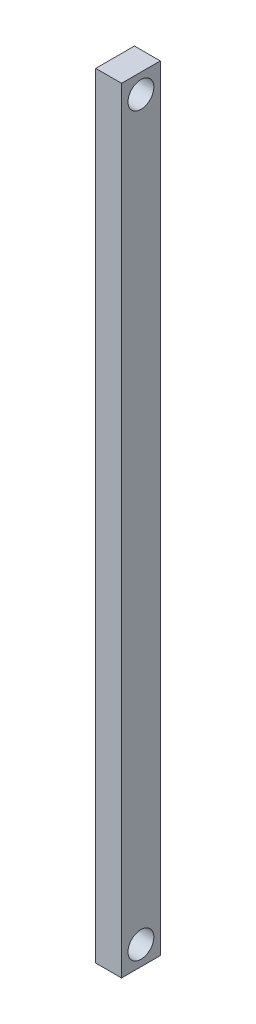
ISO-10303-21;
HEADER;
FILE_DESCRIPTION(('STEP AP214'),'2;1');
FILE_NAME('part.step','',(''),(''),'','','');
FILE_SCHEMA(('AUTOMOTIVE_DESIGN { 1 0 10303 214 1 1 1 1 }'));
ENDSEC;
DATA;
#1=APPLICATION_CONTEXT('core data for automotive mechanical design processes');
#2=APPLICATION_PROTOCOL_DEFINITION('international standard','automotive_design',2000,#1);
#3=PRODUCT_CONTEXT('',#1,'mechanical');
#4=PRODUCT('Part','Part','',(#3));
#5=PRODUCT_RELATED_PRODUCT_CATEGORY('part','',(#4));
#6=PRODUCT_DEFINITION_FORMATION('','',#4);
#7=PRODUCT_DEFINITION_CONTEXT('part definition',#1,'design');
#8=PRODUCT_DEFINITION('design','',#6,#7);
#9=PRODUCT_DEFINITION_SHAPE('','',#8);
#10=(LENGTH_UNIT() NAMED_UNIT(*) SI_UNIT(.MILLI.,.METRE.));
#11=(NAMED_UNIT(*) PLANE_ANGLE_UNIT() SI_UNIT($,.RADIAN.));
#12=(NAMED_UNIT(*) SI_UNIT($,.STERADIAN.) SOLID_ANGLE_UNIT());
#13=UNCERTAINTY_MEASURE_WITH_UNIT(LENGTH_MEASURE(1.E-05),#10,'distance_accuracy_value','');
#14=(GEOMETRIC_REPRESENTATION_CONTEXT(3) GLOBAL_UNCERTAINTY_ASSIGNED_CONTEXT((#13)) GLOBAL_UNIT_ASSIGNED_CONTEXT((#10,
#11,#12)) REPRESENTATION_CONTEXT('',''));
#15=CARTESIAN_POINT('',(0.,0.,0.));
#16=DIRECTION('',(0.,0.,1.));
#17=DIRECTION('',(1.,0.,0.));
#18=AXIS2_PLACEMENT_3D('',#15,#16,#17);
#19=CARTESIAN_POINT('',(10.,0.,15.));
#20=DIRECTION('',(0.,1.,0.));
#21=DIRECTION('',(0.,0.,1.));
#22=AXIS2_PLACEMENT_3D('',#19,#20,#21);
#23=PLANE('',#22);
#24=DIRECTION('',(0.,0.,-1.));
#25=VECTOR('',#24,1.);
#26=CARTESIAN_POINT('',(0.,0.,15.));
#27=LINE('',#26,#25);
#28=CARTESIAN_POINT('',(0.,0.,15.));
#29=VERTEX_POINT('',#28);
#30=CARTESIAN_POINT('',(0.,0.,0.));
#31=VERTEX_POINT('',#30);
#32=EDGE_CURVE('E102',#29,#31,#27,.T.);
#33=ORIENTED_EDGE('',*,*,#32,.T.);
#34=DIRECTION('',(-1.,0.,0.));
#35=VECTOR('',#34,1.);
#36=CARTESIAN_POINT('',(10.,0.,0.));
#37=LINE('',#36,#35);
#38=CARTESIAN_POINT('',(10.,0.,0.));
#39=VERTEX_POINT('',#38);
#40=EDGE_CURVE('E11',#39,#31,#37,.T.);
#41=ORIENTED_EDGE('',*,*,#40,.F.);
#42=DIRECTION('',(0.,0.,-1.));
#43=VECTOR('',#42,1.);
#44=CARTESIAN_POINT('',(10.,0.,15.));
#45=LINE('',#44,#43);
#46=CARTESIAN_POINT('',(10.,0.,15.));
#47=VERTEX_POINT('',#46);
#48=EDGE_CURVE('E95',#47,#39,#45,.T.);
#49=ORIENTED_EDGE('',*,*,#48,.F.);
#50=DIRECTION('',(-1.,0.,0.));
#51=VECTOR('',#50,1.);
#52=CARTESIAN_POINT('',(10.,0.,15.));
#53=LINE('',#52,#51);
#54=EDGE_CURVE('E99',#47,#29,#53,.T.);
#55=ORIENTED_EDGE('',*,*,#54,.T.);
#56=EDGE_LOOP('',(#33,#41,#49,#55));
#57=FACE_BOUND('',#56,.T.);
#58=ADVANCED_FACE('F41',(#57),#23,.F.);
#59=CARTESIAN_POINT('',(10.,0.,0.));
#60=DIRECTION('',(0.,0.,1.));
#61=DIRECTION('',(0.,-1.,0.));
#62=AXIS2_PLACEMENT_3D('',#59,#60,#61);
#63=PLANE('',#62);
#64=DIRECTION('',(0.,1.,0.));
#65=VECTOR('',#64,1.);
#66=CARTESIAN_POINT('',(0.,0.,0.));
#67=LINE('',#66,#65);
#68=CARTESIAN_POINT('',(0.,300.,0.));
#69=VERTEX_POINT('',#68);
#70=EDGE_CURVE('E96',#31,#69,#67,.T.);
#71=ORIENTED_EDGE('',*,*,#70,.T.);
#72=DIRECTION('',(-1.,0.,0.));
#73=VECTOR('',#72,1.);
#74=CARTESIAN_POINT('',(10.,300.,0.));
#75=LINE('',#74,#73);
#76=CARTESIAN_POINT('',(10.,300.,0.));
#77=VERTEX_POINT('',#76);
#78=EDGE_CURVE('E47',#77,#69,#75,.T.);
#79=ORIENTED_EDGE('',*,*,#78,.F.);
#80=DIRECTION('',(0.,1.,0.));
#81=VECTOR('',#80,1.);
#82=CARTESIAN_POINT('',(10.,0.,0.));
#83=LINE('',#82,#81);
#84=EDGE_CURVE('E87',#39,#77,#83,.T.);
#85=ORIENTED_EDGE('',*,*,#84,.F.);
#86=ORIENTED_EDGE('',*,*,#40,.T.);
#87=EDGE_LOOP('',(#71,#79,#85,#86));
#88=FACE_BOUND('',#87,.T.);
#89=ADVANCED_FACE('F92',(#88),#63,.F.);
#90=CARTESIAN_POINT('',(10.,300.,0.));
#91=DIRECTION('',(0.,-1.,0.));
#92=DIRECTION('',(0.,0.,-1.));
#93=AXIS2_PLACEMENT_3D('',#90,#91,#92);
#94=PLANE('',#93);
#95=DIRECTION('',(0.,0.,1.));
#96=VECTOR('',#95,1.);
#97=CARTESIAN_POINT('',(0.,300.,0.));
#98=LINE('',#97,#96);
#99=CARTESIAN_POINT('',(0.,300.,15.));
#100=VERTEX_POINT('',#99);
#101=EDGE_CURVE('E74',#69,#100,#98,.T.);
#102=ORIENTED_EDGE('',*,*,#101,.T.);
#103=DIRECTION('',(-1.,0.,0.));
#104=VECTOR('',#103,1.);
#105=CARTESIAN_POINT('',(10.,300.,15.));
#106=LINE('',#105,#104);
#107=CARTESIAN_POINT('',(10.,300.,15.));
#108=VERTEX_POINT('',#107);
#109=EDGE_CURVE('E100',#108,#100,#106,.T.);
#110=ORIENTED_EDGE('',*,*,#109,.F.);
#111=DIRECTION('',(0.,0.,1.));
#112=VECTOR('',#111,1.);
#113=CARTESIAN_POINT('',(10.,300.,0.));
#114=LINE('',#113,#112);
#115=EDGE_CURVE('E89',#77,#108,#114,.T.);
#116=ORIENTED_EDGE('',*,*,#115,.F.);
#117=ORIENTED_EDGE('',*,*,#78,.T.);
#118=EDGE_LOOP('',(#102,#110,#116,#117));
#119=FACE_BOUND('',#118,.T.);
#120=ADVANCED_FACE('F98',(#119),#94,.F.);
#121=CARTESIAN_POINT('',(10.,300.,15.));
#122=DIRECTION('',(0.,0.,-1.));
#123=DIRECTION('',(0.,1.,0.));
#124=AXIS2_PLACEMENT_3D('',#121,#122,#123);
#125=PLANE('',#124);
#126=DIRECTION('',(0.,-1.,0.));
#127=VECTOR('',#126,1.);
#128=CARTESIAN_POINT('',(0.,300.,15.));
#129=LINE('',#128,#127);
#130=EDGE_CURVE('E78',#100,#29,#129,.T.);
#131=ORIENTED_EDGE('',*,*,#130,.T.);
#132=ORIENTED_EDGE('',*,*,#54,.F.);
#133=DIRECTION('',(0.,-1.,0.));
#134=VECTOR('',#133,1.);
#135=CARTESIAN_POINT('',(10.,300.,15.));
#136=LINE('',#135,#134);
#137=EDGE_CURVE('E60',#108,#47,#136,.T.);
#138=ORIENTED_EDGE('',*,*,#137,.F.);
#139=ORIENTED_EDGE('',*,*,#109,.T.);
#140=EDGE_LOOP('',(#131,#132,#138,#139));
#141=FACE_BOUND('',#140,.T.);
#142=ADVANCED_FACE('F115',(#141),#125,.F.);
#143=CARTESIAN_POINT('',(10.,0.,0.));
#144=DIRECTION('',(1.,0.,0.));
#145=DIRECTION('',(0.,0.,-1.));
#146=AXIS2_PLACEMENT_3D('',#143,#144,#145);
#147=PLANE('',#146);
#148=CARTESIAN_POINT('',(10.,292.5,7.50000000000004));
#149=DIRECTION('',(1.,0.,0.));
#150=DIRECTION('',(0.,0.,-1.));
#151=AXIS2_PLACEMENT_3D('',#148,#149,#150);
#152=CIRCLE('',#151,4.99999999999999);
#153=CARTESIAN_POINT('',(10.,292.5,2.50000000000005));
#154=VERTEX_POINT('',#153);
#155=EDGE_CURVE('E122',#154,#154,#152,.T.);
#156=ORIENTED_EDGE('',*,*,#155,.F.);
#157=EDGE_LOOP('',(#156));
#158=FACE_BOUND('',#157,.T.);
#159=CARTESIAN_POINT('',(10.,7.50000000000002,7.50000000000007));
#160=DIRECTION('',(1.,0.,0.));
#161=DIRECTION('',(0.,0.,-1.));
#162=AXIS2_PLACEMENT_3D('',#159,#160,#161);
#163=CIRCLE('',#162,5.);
#164=CARTESIAN_POINT('',(10.,7.50000000000002,2.50000000000007));
#165=VERTEX_POINT('',#164);
#166=EDGE_CURVE('E110',#165,#165,#163,.T.);
#167=ORIENTED_EDGE('',*,*,#166,.F.);
#168=EDGE_LOOP('',(#167));
#169=FACE_BOUND('',#168,.T.);
#170=ORIENTED_EDGE('',*,*,#48,.T.);
#171=ORIENTED_EDGE('',*,*,#84,.T.);
#172=ORIENTED_EDGE('',*,*,#115,.T.);
#173=ORIENTED_EDGE('',*,*,#137,.T.);
#174=EDGE_LOOP('',(#170,#171,#172,#173));
#175=FACE_BOUND('',#174,.T.);
#176=ADVANCED_FACE('F86',(#158,#169,#175),#147,.T.);
#177=CARTESIAN_POINT('',(0.,0.,0.));
#178=DIRECTION('',(1.,0.,0.));
#179=DIRECTION('',(0.,0.,-1.));
#180=AXIS2_PLACEMENT_3D('',#177,#178,#179);
#181=PLANE('',#180);
#182=CARTESIAN_POINT('',(0.,292.5,7.50000000000004));
#183=DIRECTION('',(1.,0.,0.));
#184=DIRECTION('',(0.,0.,-1.));
#185=AXIS2_PLACEMENT_3D('',#182,#183,#184);
#186=CIRCLE('',#185,4.99999999999999);
#187=CARTESIAN_POINT('',(0.,292.5,2.50000000000005));
#188=VERTEX_POINT('',#187);
#189=EDGE_CURVE('E123',#188,#188,#186,.T.);
#190=ORIENTED_EDGE('',*,*,#189,.T.);
#191=EDGE_LOOP('',(#190));
#192=FACE_BOUND('',#191,.T.);
#193=CARTESIAN_POINT('',(0.,7.50000000000002,7.50000000000007));
#194=DIRECTION('',(1.,0.,0.));
#195=DIRECTION('',(0.,0.,-1.));
#196=AXIS2_PLACEMENT_3D('',#193,#194,#195);
#197=CIRCLE('',#196,5.);
#198=CARTESIAN_POINT('',(0.,7.50000000000002,2.50000000000007));
#199=VERTEX_POINT('',#198);
#200=EDGE_CURVE('E119',#199,#199,#197,.T.);
#201=ORIENTED_EDGE('',*,*,#200,.T.);
#202=EDGE_LOOP('',(#201));
#203=FACE_BOUND('',#202,.T.);
#204=ORIENTED_EDGE('',*,*,#32,.F.);
#205=ORIENTED_EDGE('',*,*,#130,.F.);
#206=ORIENTED_EDGE('',*,*,#101,.F.);
#207=ORIENTED_EDGE('',*,*,#70,.F.);
#208=EDGE_LOOP('',(#204,#205,#206,#207));
#209=FACE_BOUND('',#208,.T.);
#210=ADVANCED_FACE('F113',(#192,#203,#209),#181,.F.);
#211=CARTESIAN_POINT('',(10.,7.50000000000002,7.50000000000007));
#212=DIRECTION('',(-1.,0.,0.));
#213=DIRECTION('',(0.,0.,1.));
#214=AXIS2_PLACEMENT_3D('',#211,#212,#213);
#215=CYLINDRICAL_SURFACE('',#214,5.);
#216=ORIENTED_EDGE('',*,*,#166,.T.);
#217=EDGE_LOOP('',(#216));
#218=FACE_BOUND('',#217,.T.);
#219=ORIENTED_EDGE('',*,*,#200,.F.);
#220=EDGE_LOOP('',(#219));
#221=FACE_BOUND('',#220,.T.);
#222=ADVANCED_FACE('F133',(#218,#221),#215,.F.);
#223=CARTESIAN_POINT('',(0.,292.5,7.50000000000004));
#224=DIRECTION('',(1.,0.,0.));
#225=DIRECTION('',(0.,0.,-1.));
#226=AXIS2_PLACEMENT_3D('',#223,#224,#225);
#227=CYLINDRICAL_SURFACE('',#226,4.99999999999999);
#228=ORIENTED_EDGE('',*,*,#189,.F.);
#229=EDGE_LOOP('',(#228));
#230=FACE_BOUND('',#229,.T.);
#231=ORIENTED_EDGE('',*,*,#155,.T.);
#232=EDGE_LOOP('',(#231));
#233=FACE_BOUND('',#232,.T.);
#234=ADVANCED_FACE('F135',(#230,#233),#227,.F.);
#235=CLOSED_SHELL('',(#58,#89,#120,#142,#176,#210,#222,#234));
#236=MANIFOLD_SOLID_BREP('B2',#235);
#237=ADVANCED_BREP_SHAPE_REPRESENTATION('',(#18,#236),#14);
#238=SHAPE_DEFINITION_REPRESENTATION(#9,#237);
ENDSEC;
END-ISO-10303-21;
